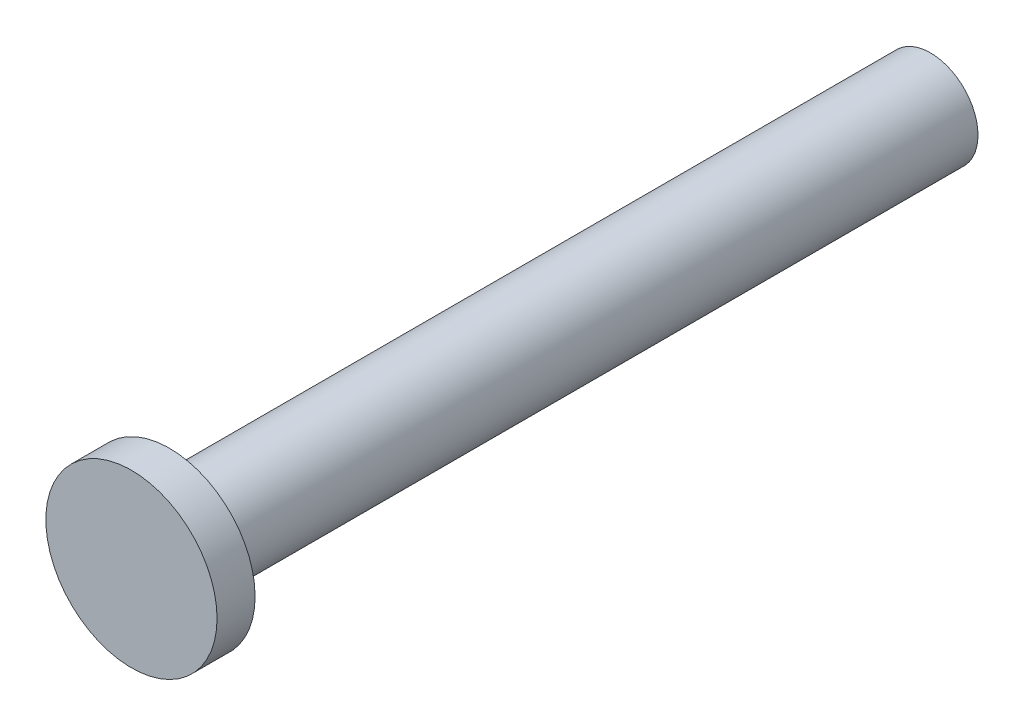
ISO-10303-21;
HEADER;
FILE_DESCRIPTION(('STEP AP214'),'2;1');
FILE_NAME('part.step','',(''),(''),'','','');
FILE_SCHEMA(('AUTOMOTIVE_DESIGN { 1 0 10303 214 1 1 1 1 }'));
ENDSEC;
DATA;
#1=APPLICATION_CONTEXT('core data for automotive mechanical design processes');
#2=APPLICATION_PROTOCOL_DEFINITION('international standard','automotive_design',2000,#1);
#3=PRODUCT_CONTEXT('',#1,'mechanical');
#4=PRODUCT('Part','Part','',(#3));
#5=PRODUCT_RELATED_PRODUCT_CATEGORY('part','',(#4));
#6=PRODUCT_DEFINITION_FORMATION('','',#4);
#7=PRODUCT_DEFINITION_CONTEXT('part definition',#1,'design');
#8=PRODUCT_DEFINITION('design','',#6,#7);
#9=PRODUCT_DEFINITION_SHAPE('','',#8);
#10=(LENGTH_UNIT() NAMED_UNIT(*) SI_UNIT(.MILLI.,.METRE.));
#11=(NAMED_UNIT(*) PLANE_ANGLE_UNIT() SI_UNIT($,.RADIAN.));
#12=(NAMED_UNIT(*) SI_UNIT($,.STERADIAN.) SOLID_ANGLE_UNIT());
#13=UNCERTAINTY_MEASURE_WITH_UNIT(LENGTH_MEASURE(1.E-05),#10,'distance_accuracy_value','');
#14=(GEOMETRIC_REPRESENTATION_CONTEXT(3) GLOBAL_UNCERTAINTY_ASSIGNED_CONTEXT((#13)) GLOBAL_UNIT_ASSIGNED_CONTEXT((#10,
#11,#12)) REPRESENTATION_CONTEXT('',''));
#15=CARTESIAN_POINT('',(0.,0.,0.));
#16=DIRECTION('',(0.,0.,1.));
#17=DIRECTION('',(1.,0.,0.));
#18=AXIS2_PLACEMENT_3D('',#15,#16,#17);
#19=CARTESIAN_POINT('',(0.,0.,40.));
#20=DIRECTION('',(0.,0.,-1.));
#21=DIRECTION('',(-1.,0.,0.));
#22=AXIS2_PLACEMENT_3D('',#19,#20,#21);
#23=CYLINDRICAL_SURFACE('',#22,2.5);
#24=CARTESIAN_POINT('',(0.,0.,40.));
#25=DIRECTION('',(0.,0.,1.));
#26=DIRECTION('',(1.,0.,0.));
#27=AXIS2_PLACEMENT_3D('',#24,#25,#26);
#28=CIRCLE('',#27,2.5);
#29=CARTESIAN_POINT('',(2.5,0.,40.));
#30=VERTEX_POINT('',#29);
#31=EDGE_CURVE('E10',#30,#30,#28,.T.);
#32=ORIENTED_EDGE('',*,*,#31,.F.);
#33=EDGE_LOOP('',(#32));
#34=FACE_BOUND('',#33,.T.);
#35=CARTESIAN_POINT('',(0.,0.,0.));
#36=DIRECTION('',(0.,0.,1.));
#37=DIRECTION('',(1.,0.,0.));
#38=AXIS2_PLACEMENT_3D('',#35,#36,#37);
#39=CIRCLE('',#38,2.5);
#40=CARTESIAN_POINT('',(2.5,0.,0.));
#41=VERTEX_POINT('',#40);
#42=EDGE_CURVE('E34',#41,#41,#39,.T.);
#43=ORIENTED_EDGE('',*,*,#42,.T.);
#44=EDGE_LOOP('',(#43));
#45=FACE_BOUND('',#44,.T.);
#46=ADVANCED_FACE('F31',(#34,#45),#23,.T.);
#47=CARTESIAN_POINT('',(0.,0.,0.));
#48=DIRECTION('',(0.,0.,1.));
#49=DIRECTION('',(1.,0.,0.));
#50=AXIS2_PLACEMENT_3D('',#47,#48,#49);
#51=PLANE('',#50);
#52=ORIENTED_EDGE('',*,*,#42,.F.);
#53=EDGE_LOOP('',(#52));
#54=FACE_BOUND('',#53,.T.);
#55=ADVANCED_FACE('F54',(#54),#51,.F.);
#56=CARTESIAN_POINT('',(0.,0.,42.));
#57=DIRECTION('',(0.,0.,-1.));
#58=DIRECTION('',(-1.,0.,0.));
#59=AXIS2_PLACEMENT_3D('',#56,#57,#58);
#60=CYLINDRICAL_SURFACE('',#59,4.5);
#61=CARTESIAN_POINT('',(0.,0.,42.));
#62=DIRECTION('',(0.,0.,1.));
#63=DIRECTION('',(1.,0.,0.));
#64=AXIS2_PLACEMENT_3D('',#61,#62,#63);
#65=CIRCLE('',#64,4.5);
#66=CARTESIAN_POINT('',(4.5,0.,42.));
#67=VERTEX_POINT('',#66);
#68=EDGE_CURVE('E41',#67,#67,#65,.T.);
#69=ORIENTED_EDGE('',*,*,#68,.F.);
#70=EDGE_LOOP('',(#69));
#71=FACE_BOUND('',#70,.T.);
#72=CARTESIAN_POINT('',(0.,0.,40.));
#73=DIRECTION('',(0.,0.,1.));
#74=DIRECTION('',(1.,0.,0.));
#75=AXIS2_PLACEMENT_3D('',#72,#73,#74);
#76=CIRCLE('',#75,4.5);
#77=CARTESIAN_POINT('',(4.5,0.,40.));
#78=VERTEX_POINT('',#77);
#79=EDGE_CURVE('E43',#78,#78,#76,.T.);
#80=ORIENTED_EDGE('',*,*,#79,.T.);
#81=EDGE_LOOP('',(#80));
#82=FACE_BOUND('',#81,.T.);
#83=ADVANCED_FACE('F51',(#71,#82),#60,.T.);
#84=CARTESIAN_POINT('',(0.,0.,42.));
#85=DIRECTION('',(0.,0.,1.));
#86=DIRECTION('',(1.,0.,0.));
#87=AXIS2_PLACEMENT_3D('',#84,#85,#86);
#88=PLANE('',#87);
#89=ORIENTED_EDGE('',*,*,#68,.T.);
#90=EDGE_LOOP('',(#89));
#91=FACE_BOUND('',#90,.T.);
#92=ADVANCED_FACE('F49',(#91),#88,.T.);
#93=CARTESIAN_POINT('',(0.,0.,40.));
#94=DIRECTION('',(0.,0.,1.));
#95=DIRECTION('',(1.,0.,0.));
#96=AXIS2_PLACEMENT_3D('',#93,#94,#95);
#97=PLANE('',#96);
#98=ORIENTED_EDGE('',*,*,#31,.T.);
#99=EDGE_LOOP('',(#98));
#100=FACE_BOUND('',#99,.T.);
#101=ORIENTED_EDGE('',*,*,#79,.F.);
#102=EDGE_LOOP('',(#101));
#103=FACE_BOUND('',#102,.T.);
#104=ADVANCED_FACE('F58',(#100,#103),#97,.F.);
#105=CLOSED_SHELL('',(#46,#55,#83,#92,#104));
#106=MANIFOLD_SOLID_BREP('B2',#105);
#107=ADVANCED_BREP_SHAPE_REPRESENTATION('',(#18,#106),#14);
#108=SHAPE_DEFINITION_REPRESENTATION(#9,#107);
ENDSEC;
END-ISO-10303-21;
